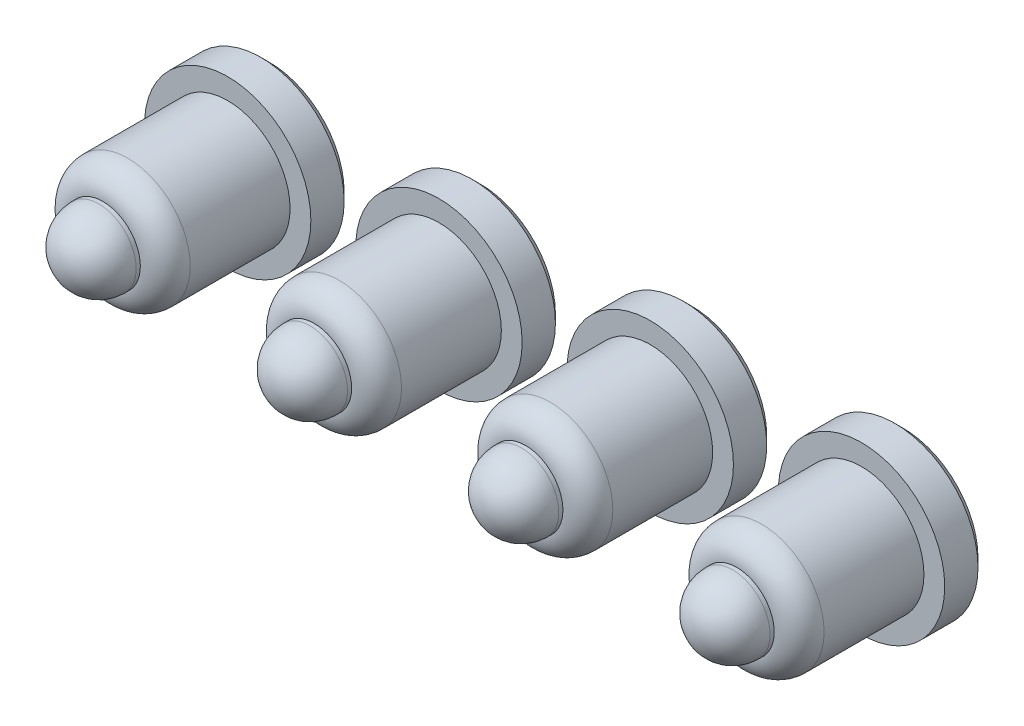
ISO-10303-21;
HEADER;
FILE_DESCRIPTION(('STEP AP214'),'2;1');
FILE_NAME('part.step','',(''),(''),'','','');
FILE_SCHEMA(('AUTOMOTIVE_DESIGN { 1 0 10303 214 1 1 1 1 }'));
ENDSEC;
DATA;
#1=APPLICATION_CONTEXT('core data for automotive mechanical design processes');
#2=APPLICATION_PROTOCOL_DEFINITION('international standard','automotive_design',2000,#1);
#3=PRODUCT_CONTEXT('',#1,'mechanical');
#4=PRODUCT('Part','Part','',(#3));
#5=PRODUCT_RELATED_PRODUCT_CATEGORY('part','',(#4));
#6=PRODUCT_DEFINITION_FORMATION('','',#4);
#7=PRODUCT_DEFINITION_CONTEXT('part definition',#1,'design');
#8=PRODUCT_DEFINITION('design','',#6,#7);
#9=PRODUCT_DEFINITION_SHAPE('','',#8);
#10=(LENGTH_UNIT() NAMED_UNIT(*) SI_UNIT(.MILLI.,.METRE.));
#11=(NAMED_UNIT(*) PLANE_ANGLE_UNIT() SI_UNIT($,.RADIAN.));
#12=(NAMED_UNIT(*) SI_UNIT($,.STERADIAN.) SOLID_ANGLE_UNIT());
#13=UNCERTAINTY_MEASURE_WITH_UNIT(LENGTH_MEASURE(1.E-05),#10,'distance_accuracy_value','');
#14=(GEOMETRIC_REPRESENTATION_CONTEXT(3) GLOBAL_UNCERTAINTY_ASSIGNED_CONTEXT((#13)) GLOBAL_UNIT_ASSIGNED_CONTEXT((#10,
#11,#12)) REPRESENTATION_CONTEXT('',''));
#15=CARTESIAN_POINT('',(0.,0.,0.));
#16=DIRECTION('',(0.,0.,1.));
#17=DIRECTION('',(1.,0.,0.));
#18=AXIS2_PLACEMENT_3D('',#15,#16,#17);
#19=CARTESIAN_POINT('',(7.62,0.,2.));
#20=DIRECTION('',(0.,0.,-1.));
#21=DIRECTION('',(-1.,0.,0.));
#22=AXIS2_PLACEMENT_3D('',#19,#20,#21);
#23=CYLINDRICAL_SURFACE('',#22,0.45);
#24=CARTESIAN_POINT('',(7.62,0.,1.55));
#25=DIRECTION('',(0.,0.,-1.));
#26=DIRECTION('',(-1.,0.,0.));
#27=AXIS2_PLACEMENT_3D('',#24,#25,#26);
#28=CIRCLE('',#27,0.45);
#29=CARTESIAN_POINT('',(7.17,0.,1.55));
#30=VERTEX_POINT('',#29);
#31=EDGE_CURVE('E11',#30,#30,#28,.T.);
#32=ORIENTED_EDGE('',*,*,#31,.T.);
#33=EDGE_LOOP('',(#32));
#34=FACE_BOUND('',#33,.T.);
#35=CARTESIAN_POINT('',(7.62,0.,1.5));
#36=DIRECTION('',(0.,0.,1.));
#37=DIRECTION('',(1.,0.,0.));
#38=AXIS2_PLACEMENT_3D('',#35,#36,#37);
#39=CIRCLE('',#38,0.45);
#40=CARTESIAN_POINT('',(8.07,0.,1.5));
#41=VERTEX_POINT('',#40);
#42=EDGE_CURVE('E51',#41,#41,#39,.T.);
#43=ORIENTED_EDGE('',*,*,#42,.T.);
#44=EDGE_LOOP('',(#43));
#45=FACE_BOUND('',#44,.T.);
#46=ADVANCED_FACE('F44',(#34,#45),#23,.T.);
#47=CARTESIAN_POINT('',(7.62,0.,1.5));
#48=DIRECTION('',(0.,0.,1.));
#49=DIRECTION('',(1.,0.,0.));
#50=AXIS2_PLACEMENT_3D('',#47,#48,#49);
#51=PLANE('',#50);
#52=ORIENTED_EDGE('',*,*,#42,.F.);
#53=EDGE_LOOP('',(#52));
#54=FACE_BOUND('',#53,.T.);
#55=ADVANCED_FACE('F58',(#54),#51,.F.);
#56=CARTESIAN_POINT('',(7.62,0.,1.55));
#57=DIRECTION('',(0.,0.,1.));
#58=DIRECTION('',(1.,0.,0.));
#59=AXIS2_PLACEMENT_3D('',#56,#57,#58);
#60=SPHERICAL_SURFACE('',#59,0.45);
#61=ORIENTED_EDGE('',*,*,#31,.F.);
#62=EDGE_LOOP('',(#61));
#63=FACE_BOUND('',#62,.T.);
#64=ADVANCED_FACE('F46',(#63),#60,.T.);
#65=CLOSED_SHELL('',(#46,#55,#64));
#66=MANIFOLD_SOLID_BREP('B2',#65);
#67=CARTESIAN_POINT('',(5.08,0.,2.));
#68=DIRECTION('',(0.,0.,-1.));
#69=DIRECTION('',(-1.,0.,0.));
#70=AXIS2_PLACEMENT_3D('',#67,#68,#69);
#71=CYLINDRICAL_SURFACE('',#70,0.45);
#72=CARTESIAN_POINT('',(5.08,0.,1.55));
#73=DIRECTION('',(0.,0.,-1.));
#74=DIRECTION('',(-1.,0.,0.));
#75=AXIS2_PLACEMENT_3D('',#72,#73,#74);
#76=CIRCLE('',#75,0.45);
#77=CARTESIAN_POINT('',(4.63,0.,1.55));
#78=VERTEX_POINT('',#77);
#79=EDGE_CURVE('E43',#78,#78,#76,.T.);
#80=ORIENTED_EDGE('',*,*,#79,.T.);
#81=EDGE_LOOP('',(#80));
#82=FACE_BOUND('',#81,.T.);
#83=CARTESIAN_POINT('',(5.08,0.,1.5));
#84=DIRECTION('',(0.,0.,1.));
#85=DIRECTION('',(1.,0.,0.));
#86=AXIS2_PLACEMENT_3D('',#83,#84,#85);
#87=CIRCLE('',#86,0.45);
#88=CARTESIAN_POINT('',(5.53,0.,1.5));
#89=VERTEX_POINT('',#88);
#90=EDGE_CURVE('E100',#89,#89,#87,.T.);
#91=ORIENTED_EDGE('',*,*,#90,.T.);
#92=EDGE_LOOP('',(#91));
#93=FACE_BOUND('',#92,.T.);
#94=ADVANCED_FACE('F93',(#82,#93),#71,.T.);
#95=CARTESIAN_POINT('',(5.08,0.,1.5));
#96=DIRECTION('',(0.,0.,1.));
#97=DIRECTION('',(1.,0.,0.));
#98=AXIS2_PLACEMENT_3D('',#95,#96,#97);
#99=PLANE('',#98);
#100=ORIENTED_EDGE('',*,*,#90,.F.);
#101=EDGE_LOOP('',(#100));
#102=FACE_BOUND('',#101,.T.);
#103=ADVANCED_FACE('F107',(#102),#99,.F.);
#104=CARTESIAN_POINT('',(5.08,0.,1.55));
#105=DIRECTION('',(0.,0.,1.));
#106=DIRECTION('',(1.,0.,0.));
#107=AXIS2_PLACEMENT_3D('',#104,#105,#106);
#108=SPHERICAL_SURFACE('',#107,0.45);
#109=ORIENTED_EDGE('',*,*,#79,.F.);
#110=EDGE_LOOP('',(#109));
#111=FACE_BOUND('',#110,.T.);
#112=ADVANCED_FACE('F95',(#111),#108,.T.);
#113=CLOSED_SHELL('',(#94,#103,#112));
#114=MANIFOLD_SOLID_BREP('B6',#113);
#115=CARTESIAN_POINT('',(2.54,0.,2.));
#116=DIRECTION('',(0.,0.,-1.));
#117=DIRECTION('',(-1.,0.,0.));
#118=AXIS2_PLACEMENT_3D('',#115,#116,#117);
#119=CYLINDRICAL_SURFACE('',#118,0.45);
#120=CARTESIAN_POINT('',(2.54,0.,1.55));
#121=DIRECTION('',(0.,0.,-1.));
#122=DIRECTION('',(-1.,0.,0.));
#123=AXIS2_PLACEMENT_3D('',#120,#121,#122);
#124=CIRCLE('',#123,0.45);
#125=CARTESIAN_POINT('',(2.09,0.,1.55));
#126=VERTEX_POINT('',#125);
#127=EDGE_CURVE('E92',#126,#126,#124,.T.);
#128=ORIENTED_EDGE('',*,*,#127,.T.);
#129=EDGE_LOOP('',(#128));
#130=FACE_BOUND('',#129,.T.);
#131=CARTESIAN_POINT('',(2.54,0.,1.5));
#132=DIRECTION('',(0.,0.,1.));
#133=DIRECTION('',(1.,0.,0.));
#134=AXIS2_PLACEMENT_3D('',#131,#132,#133);
#135=CIRCLE('',#134,0.45);
#136=CARTESIAN_POINT('',(2.99,0.,1.5));
#137=VERTEX_POINT('',#136);
#138=EDGE_CURVE('E149',#137,#137,#135,.T.);
#139=ORIENTED_EDGE('',*,*,#138,.T.);
#140=EDGE_LOOP('',(#139));
#141=FACE_BOUND('',#140,.T.);
#142=ADVANCED_FACE('F142',(#130,#141),#119,.T.);
#143=CARTESIAN_POINT('',(2.54,0.,1.5));
#144=DIRECTION('',(0.,0.,1.));
#145=DIRECTION('',(1.,0.,0.));
#146=AXIS2_PLACEMENT_3D('',#143,#144,#145);
#147=PLANE('',#146);
#148=ORIENTED_EDGE('',*,*,#138,.F.);
#149=EDGE_LOOP('',(#148));
#150=FACE_BOUND('',#149,.T.);
#151=ADVANCED_FACE('F156',(#150),#147,.F.);
#152=CARTESIAN_POINT('',(2.54,0.,1.55));
#153=DIRECTION('',(0.,0.,1.));
#154=DIRECTION('',(1.,0.,0.));
#155=AXIS2_PLACEMENT_3D('',#152,#153,#154);
#156=SPHERICAL_SURFACE('',#155,0.45);
#157=ORIENTED_EDGE('',*,*,#127,.F.);
#158=EDGE_LOOP('',(#157));
#159=FACE_BOUND('',#158,.T.);
#160=ADVANCED_FACE('F144',(#159),#156,.T.);
#161=CLOSED_SHELL('',(#142,#151,#160));
#162=MANIFOLD_SOLID_BREP('B38',#161);
#163=CARTESIAN_POINT('',(7.62,0.,-0.5));
#164=DIRECTION('',(0.,0.,1.));
#165=DIRECTION('',(1.,0.,0.));
#166=AXIS2_PLACEMENT_3D('',#163,#164,#165);
#167=CYLINDRICAL_SURFACE('',#166,1.);
#168=CARTESIAN_POINT('',(7.62,0.,-0.399999999999999));
#169=DIRECTION('',(0.,0.,1.));
#170=DIRECTION('',(1.,0.,0.));
#171=AXIS2_PLACEMENT_3D('',#168,#169,#170);
#172=CIRCLE('',#171,1.);
#173=CARTESIAN_POINT('',(8.62,0.,-0.399999999999999));
#174=VERTEX_POINT('',#173);
#175=EDGE_CURVE('E198',#174,#174,#172,.T.);
#176=ORIENTED_EDGE('',*,*,#175,.T.);
#177=EDGE_LOOP('',(#176));
#178=FACE_BOUND('',#177,.T.);
#179=CARTESIAN_POINT('',(7.62,0.,0.));
#180=DIRECTION('',(0.,0.,1.));
#181=DIRECTION('',(1.,0.,0.));
#182=AXIS2_PLACEMENT_3D('',#179,#180,#181);
#183=CIRCLE('',#182,1.);
#184=CARTESIAN_POINT('',(8.62,0.,0.));
#185=VERTEX_POINT('',#184);
#186=EDGE_CURVE('E202',#185,#185,#183,.T.);
#187=ORIENTED_EDGE('',*,*,#186,.F.);
#188=EDGE_LOOP('',(#187));
#189=FACE_BOUND('',#188,.T.);
#190=ADVANCED_FACE('F191',(#178,#189),#167,.T.);
#191=CARTESIAN_POINT('',(7.62,0.,-0.5));
#192=DIRECTION('',(0.,0.,1.));
#193=DIRECTION('',(1.,0.,0.));
#194=AXIS2_PLACEMENT_3D('',#191,#192,#193);
#195=PLANE('',#194);
#196=CARTESIAN_POINT('',(7.62,0.,-0.5));
#197=DIRECTION('',(0.,0.,1.));
#198=DIRECTION('',(1.,0.,0.));
#199=AXIS2_PLACEMENT_3D('',#196,#197,#198);
#200=CIRCLE('',#199,0.9);
#201=CARTESIAN_POINT('',(8.52,0.,-0.5));
#202=VERTEX_POINT('',#201);
#203=EDGE_CURVE('E141',#202,#202,#200,.F.);
#204=ORIENTED_EDGE('',*,*,#203,.T.);
#205=EDGE_LOOP('',(#204));
#206=FACE_BOUND('',#205,.T.);
#207=ADVANCED_FACE('F212',(#206),#195,.F.);
#208=CARTESIAN_POINT('',(7.62,0.,0.));
#209=DIRECTION('',(0.,0.,1.));
#210=DIRECTION('',(1.,0.,0.));
#211=AXIS2_PLACEMENT_3D('',#208,#209,#210);
#212=PLANE('',#211);
#213=ORIENTED_EDGE('',*,*,#186,.T.);
#214=EDGE_LOOP('',(#213));
#215=FACE_BOUND('',#214,.T.);
#216=ADVANCED_FACE('F209',(#215),#212,.T.);
#217=CARTESIAN_POINT('',(7.62,0.,-0.399999999999999));
#218=DIRECTION('',(0.,0.,1.));
#219=DIRECTION('',(1.,0.,0.));
#220=AXIS2_PLACEMENT_3D('',#217,#218,#219);
#221=CONICAL_SURFACE('',#220,1.,0.785398163397444);
#222=ORIENTED_EDGE('',*,*,#203,.F.);
#223=EDGE_LOOP('',(#222));
#224=FACE_BOUND('',#223,.T.);
#225=ORIENTED_EDGE('',*,*,#175,.F.);
#226=EDGE_LOOP('',(#225));
#227=FACE_BOUND('',#226,.T.);
#228=ADVANCED_FACE('F193',(#224,#227),#221,.T.);
#229=CLOSED_SHELL('',(#190,#207,#216,#228));
#230=MANIFOLD_SOLID_BREP('B87',#229);
#231=CARTESIAN_POINT('',(5.08,0.,-0.5));
#232=DIRECTION('',(0.,0.,1.));
#233=DIRECTION('',(1.,0.,0.));
#234=AXIS2_PLACEMENT_3D('',#231,#232,#233);
#235=CYLINDRICAL_SURFACE('',#234,1.);
#236=CARTESIAN_POINT('',(5.08,0.,-0.4));
#237=DIRECTION('',(0.,0.,1.));
#238=DIRECTION('',(1.,0.,0.));
#239=AXIS2_PLACEMENT_3D('',#236,#237,#238);
#240=CIRCLE('',#239,1.);
#241=CARTESIAN_POINT('',(6.08,0.,-0.4));
#242=VERTEX_POINT('',#241);
#243=EDGE_CURVE('E262',#242,#242,#240,.T.);
#244=ORIENTED_EDGE('',*,*,#243,.T.);
#245=EDGE_LOOP('',(#244));
#246=FACE_BOUND('',#245,.T.);
#247=CARTESIAN_POINT('',(5.08,0.,0.));
#248=DIRECTION('',(0.,0.,1.));
#249=DIRECTION('',(1.,0.,0.));
#250=AXIS2_PLACEMENT_3D('',#247,#248,#249);
#251=CIRCLE('',#250,1.);
#252=CARTESIAN_POINT('',(6.08,0.,0.));
#253=VERTEX_POINT('',#252);
#254=EDGE_CURVE('E266',#253,#253,#251,.T.);
#255=ORIENTED_EDGE('',*,*,#254,.F.);
#256=EDGE_LOOP('',(#255));
#257=FACE_BOUND('',#256,.T.);
#258=ADVANCED_FACE('F255',(#246,#257),#235,.T.);
#259=CARTESIAN_POINT('',(5.08,0.,-0.5));
#260=DIRECTION('',(0.,0.,1.));
#261=DIRECTION('',(1.,0.,0.));
#262=AXIS2_PLACEMENT_3D('',#259,#260,#261);
#263=PLANE('',#262);
#264=CARTESIAN_POINT('',(5.08,0.,-0.5));
#265=DIRECTION('',(0.,0.,1.));
#266=DIRECTION('',(1.,0.,0.));
#267=AXIS2_PLACEMENT_3D('',#264,#265,#266);
#268=CIRCLE('',#267,0.9);
#269=CARTESIAN_POINT('',(5.98,0.,-0.5));
#270=VERTEX_POINT('',#269);
#271=EDGE_CURVE('E190',#270,#270,#268,.F.);
#272=ORIENTED_EDGE('',*,*,#271,.T.);
#273=EDGE_LOOP('',(#272));
#274=FACE_BOUND('',#273,.T.);
#275=ADVANCED_FACE('F276',(#274),#263,.F.);
#276=CARTESIAN_POINT('',(5.08,0.,0.));
#277=DIRECTION('',(0.,0.,1.));
#278=DIRECTION('',(1.,0.,0.));
#279=AXIS2_PLACEMENT_3D('',#276,#277,#278);
#280=PLANE('',#279);
#281=ORIENTED_EDGE('',*,*,#254,.T.);
#282=EDGE_LOOP('',(#281));
#283=FACE_BOUND('',#282,.T.);
#284=ADVANCED_FACE('F273',(#283),#280,.T.);
#285=CARTESIAN_POINT('',(5.08,0.,-0.4));
#286=DIRECTION('',(0.,0.,1.));
#287=DIRECTION('',(1.,0.,0.));
#288=AXIS2_PLACEMENT_3D('',#285,#286,#287);
#289=CONICAL_SURFACE('',#288,1.,0.785398163397447);
#290=ORIENTED_EDGE('',*,*,#271,.F.);
#291=EDGE_LOOP('',(#290));
#292=FACE_BOUND('',#291,.T.);
#293=ORIENTED_EDGE('',*,*,#243,.F.);
#294=EDGE_LOOP('',(#293));
#295=FACE_BOUND('',#294,.T.);
#296=ADVANCED_FACE('F257',(#292,#295),#289,.T.);
#297=CLOSED_SHELL('',(#258,#275,#284,#296));
#298=MANIFOLD_SOLID_BREP('B136',#297);
#299=CARTESIAN_POINT('',(2.54,0.,-0.5));
#300=DIRECTION('',(0.,0.,1.));
#301=DIRECTION('',(1.,0.,0.));
#302=AXIS2_PLACEMENT_3D('',#299,#300,#301);
#303=CYLINDRICAL_SURFACE('',#302,1.);
#304=CARTESIAN_POINT('',(2.54,0.,-0.4));
#305=DIRECTION('',(0.,0.,1.));
#306=DIRECTION('',(1.,0.,0.));
#307=AXIS2_PLACEMENT_3D('',#304,#305,#306);
#308=CIRCLE('',#307,1.);
#309=CARTESIAN_POINT('',(3.54,0.,-0.4));
#310=VERTEX_POINT('',#309);
#311=EDGE_CURVE('E326',#310,#310,#308,.T.);
#312=ORIENTED_EDGE('',*,*,#311,.T.);
#313=EDGE_LOOP('',(#312));
#314=FACE_BOUND('',#313,.T.);
#315=CARTESIAN_POINT('',(2.54,0.,0.));
#316=DIRECTION('',(0.,0.,1.));
#317=DIRECTION('',(1.,0.,0.));
#318=AXIS2_PLACEMENT_3D('',#315,#316,#317);
#319=CIRCLE('',#318,1.);
#320=CARTESIAN_POINT('',(3.54,0.,0.));
#321=VERTEX_POINT('',#320);
#322=EDGE_CURVE('E330',#321,#321,#319,.T.);
#323=ORIENTED_EDGE('',*,*,#322,.F.);
#324=EDGE_LOOP('',(#323));
#325=FACE_BOUND('',#324,.T.);
#326=ADVANCED_FACE('F319',(#314,#325),#303,.T.);
#327=CARTESIAN_POINT('',(2.54,0.,-0.5));
#328=DIRECTION('',(0.,0.,1.));
#329=DIRECTION('',(1.,0.,0.));
#330=AXIS2_PLACEMENT_3D('',#327,#328,#329);
#331=PLANE('',#330);
#332=CARTESIAN_POINT('',(2.54,0.,-0.5));
#333=DIRECTION('',(0.,0.,1.));
#334=DIRECTION('',(1.,0.,0.));
#335=AXIS2_PLACEMENT_3D('',#332,#333,#334);
#336=CIRCLE('',#335,0.9);
#337=CARTESIAN_POINT('',(3.44,0.,-0.5));
#338=VERTEX_POINT('',#337);
#339=EDGE_CURVE('E254',#338,#338,#336,.F.);
#340=ORIENTED_EDGE('',*,*,#339,.T.);
#341=EDGE_LOOP('',(#340));
#342=FACE_BOUND('',#341,.T.);
#343=ADVANCED_FACE('F340',(#342),#331,.F.);
#344=CARTESIAN_POINT('',(2.54,0.,0.));
#345=DIRECTION('',(0.,0.,1.));
#346=DIRECTION('',(1.,0.,0.));
#347=AXIS2_PLACEMENT_3D('',#344,#345,#346);
#348=PLANE('',#347);
#349=ORIENTED_EDGE('',*,*,#322,.T.);
#350=EDGE_LOOP('',(#349));
#351=FACE_BOUND('',#350,.T.);
#352=ADVANCED_FACE('F337',(#351),#348,.T.);
#353=CARTESIAN_POINT('',(2.54,0.,-0.4));
#354=DIRECTION('',(0.,0.,1.));
#355=DIRECTION('',(1.,0.,0.));
#356=AXIS2_PLACEMENT_3D('',#353,#354,#355);
#357=CONICAL_SURFACE('',#356,1.,0.785398163397449);
#358=ORIENTED_EDGE('',*,*,#339,.F.);
#359=EDGE_LOOP('',(#358));
#360=FACE_BOUND('',#359,.T.);
#361=ORIENTED_EDGE('',*,*,#311,.F.);
#362=EDGE_LOOP('',(#361));
#363=FACE_BOUND('',#362,.T.);
#364=ADVANCED_FACE('F321',(#360,#363),#357,.T.);
#365=CLOSED_SHELL('',(#326,#343,#352,#364));
#366=MANIFOLD_SOLID_BREP('B185',#365);
#367=CARTESIAN_POINT('',(7.62,0.,1.5));
#368=DIRECTION('',(0.,0.,-1.));
#369=DIRECTION('',(-1.,0.,0.));
#370=AXIS2_PLACEMENT_3D('',#367,#368,#369);
#371=CYLINDRICAL_SURFACE('',#370,0.75);
#372=CARTESIAN_POINT('',(7.62,0.,1.2));
#373=DIRECTION('',(0.,0.,1.));
#374=DIRECTION('',(1.,0.,0.));
#375=AXIS2_PLACEMENT_3D('',#372,#373,#374);
#376=CIRCLE('',#375,0.75);
#377=CARTESIAN_POINT('',(8.37,0.,1.2));
#378=VERTEX_POINT('',#377);
#379=EDGE_CURVE('E318',#378,#378,#376,.F.);
#380=ORIENTED_EDGE('',*,*,#379,.T.);
#381=EDGE_LOOP('',(#380));
#382=FACE_BOUND('',#381,.T.);
#383=CARTESIAN_POINT('',(7.62,0.,0.));
#384=DIRECTION('',(0.,0.,1.));
#385=DIRECTION('',(1.,0.,0.));
#386=AXIS2_PLACEMENT_3D('',#383,#384,#385);
#387=CIRCLE('',#386,0.75);
#388=CARTESIAN_POINT('',(8.37,0.,0.));
#389=VERTEX_POINT('',#388);
#390=EDGE_CURVE('E394',#389,#389,#387,.T.);
#391=ORIENTED_EDGE('',*,*,#390,.T.);
#392=EDGE_LOOP('',(#391));
#393=FACE_BOUND('',#392,.T.);
#394=ADVANCED_FACE('F383',(#382,#393),#371,.T.);
#395=CARTESIAN_POINT('',(7.62,0.,1.5));
#396=DIRECTION('',(0.,0.,1.));
#397=DIRECTION('',(1.,0.,0.));
#398=AXIS2_PLACEMENT_3D('',#395,#396,#397);
#399=PLANE('',#398);
#400=CARTESIAN_POINT('',(7.62,0.,1.5));
#401=DIRECTION('',(0.,0.,1.));
#402=DIRECTION('',(1.,0.,0.));
#403=AXIS2_PLACEMENT_3D('',#400,#401,#402);
#404=CIRCLE('',#403,0.45);
#405=CARTESIAN_POINT('',(8.07,0.,1.5));
#406=VERTEX_POINT('',#405);
#407=EDGE_CURVE('E390',#406,#406,#404,.T.);
#408=ORIENTED_EDGE('',*,*,#407,.T.);
#409=EDGE_LOOP('',(#408));
#410=FACE_BOUND('',#409,.T.);
#411=ADVANCED_FACE('F404',(#410),#399,.T.);
#412=CARTESIAN_POINT('',(7.62,0.,0.));
#413=DIRECTION('',(0.,0.,1.));
#414=DIRECTION('',(1.,0.,0.));
#415=AXIS2_PLACEMENT_3D('',#412,#413,#414);
#416=PLANE('',#415);
#417=ORIENTED_EDGE('',*,*,#390,.F.);
#418=EDGE_LOOP('',(#417));
#419=FACE_BOUND('',#418,.T.);
#420=ADVANCED_FACE('F402',(#419),#416,.F.);
#421=CARTESIAN_POINT('',(7.62,0.,1.2));
#422=DIRECTION('',(0.,0.,1.));
#423=DIRECTION('',(1.,0.,0.));
#424=AXIS2_PLACEMENT_3D('',#421,#422,#423);
#425=TOROIDAL_SURFACE('',#424,0.45,0.3);
#426=ORIENTED_EDGE('',*,*,#379,.F.);
#427=EDGE_LOOP('',(#426));
#428=FACE_BOUND('',#427,.T.);
#429=ORIENTED_EDGE('',*,*,#407,.F.);
#430=EDGE_LOOP('',(#429));
#431=FACE_BOUND('',#430,.T.);
#432=ADVANCED_FACE('F385',(#428,#431),#425,.T.);
#433=CLOSED_SHELL('',(#394,#411,#420,#432));
#434=MANIFOLD_SOLID_BREP('B249',#433);
#435=CARTESIAN_POINT('',(5.08,0.,1.5));
#436=DIRECTION('',(0.,0.,-1.));
#437=DIRECTION('',(-1.,0.,0.));
#438=AXIS2_PLACEMENT_3D('',#435,#436,#437);
#439=CYLINDRICAL_SURFACE('',#438,0.749999999999999);
#440=CARTESIAN_POINT('',(5.08,0.,1.2));
#441=DIRECTION('',(0.,0.,1.));
#442=DIRECTION('',(1.,0.,0.));
#443=AXIS2_PLACEMENT_3D('',#440,#441,#442);
#444=CIRCLE('',#443,0.749999999999999);
#445=CARTESIAN_POINT('',(5.83,0.,1.2));
#446=VERTEX_POINT('',#445);
#447=EDGE_CURVE('E382',#446,#446,#444,.F.);
#448=ORIENTED_EDGE('',*,*,#447,.T.);
#449=EDGE_LOOP('',(#448));
#450=FACE_BOUND('',#449,.T.);
#451=CARTESIAN_POINT('',(5.08,0.,0.));
#452=DIRECTION('',(0.,0.,1.));
#453=DIRECTION('',(1.,0.,0.));
#454=AXIS2_PLACEMENT_3D('',#451,#452,#453);
#455=CIRCLE('',#454,0.749999999999999);
#456=CARTESIAN_POINT('',(5.83,0.,0.));
#457=VERTEX_POINT('',#456);
#458=EDGE_CURVE('E458',#457,#457,#455,.T.);
#459=ORIENTED_EDGE('',*,*,#458,.T.);
#460=EDGE_LOOP('',(#459));
#461=FACE_BOUND('',#460,.T.);
#462=ADVANCED_FACE('F447',(#450,#461),#439,.T.);
#463=CARTESIAN_POINT('',(5.08,0.,1.5));
#464=DIRECTION('',(0.,0.,1.));
#465=DIRECTION('',(1.,0.,0.));
#466=AXIS2_PLACEMENT_3D('',#463,#464,#465);
#467=PLANE('',#466);
#468=CARTESIAN_POINT('',(5.08,0.,1.5));
#469=DIRECTION('',(0.,0.,1.));
#470=DIRECTION('',(1.,0.,0.));
#471=AXIS2_PLACEMENT_3D('',#468,#469,#470);
#472=CIRCLE('',#471,0.449999999999999);
#473=CARTESIAN_POINT('',(5.53,0.,1.5));
#474=VERTEX_POINT('',#473);
#475=EDGE_CURVE('E454',#474,#474,#472,.T.);
#476=ORIENTED_EDGE('',*,*,#475,.T.);
#477=EDGE_LOOP('',(#476));
#478=FACE_BOUND('',#477,.T.);
#479=ADVANCED_FACE('F468',(#478),#467,.T.);
#480=CARTESIAN_POINT('',(5.08,0.,0.));
#481=DIRECTION('',(0.,0.,1.));
#482=DIRECTION('',(1.,0.,0.));
#483=AXIS2_PLACEMENT_3D('',#480,#481,#482);
#484=PLANE('',#483);
#485=ORIENTED_EDGE('',*,*,#458,.F.);
#486=EDGE_LOOP('',(#485));
#487=FACE_BOUND('',#486,.T.);
#488=ADVANCED_FACE('F466',(#487),#484,.F.);
#489=CARTESIAN_POINT('',(5.08,0.,1.2));
#490=DIRECTION('',(0.,0.,1.));
#491=DIRECTION('',(1.,0.,0.));
#492=AXIS2_PLACEMENT_3D('',#489,#490,#491);
#493=TOROIDAL_SURFACE('',#492,0.449999999999999,0.3);
#494=ORIENTED_EDGE('',*,*,#447,.F.);
#495=EDGE_LOOP('',(#494));
#496=FACE_BOUND('',#495,.T.);
#497=ORIENTED_EDGE('',*,*,#475,.F.);
#498=EDGE_LOOP('',(#497));
#499=FACE_BOUND('',#498,.T.);
#500=ADVANCED_FACE('F449',(#496,#499),#493,.T.);
#501=CLOSED_SHELL('',(#462,#479,#488,#500));
#502=MANIFOLD_SOLID_BREP('B313',#501);
#503=CARTESIAN_POINT('',(2.54,0.,1.5));
#504=DIRECTION('',(0.,0.,-1.));
#505=DIRECTION('',(-1.,0.,0.));
#506=AXIS2_PLACEMENT_3D('',#503,#504,#505);
#507=CYLINDRICAL_SURFACE('',#506,0.75);
#508=CARTESIAN_POINT('',(2.54,0.,1.2));
#509=DIRECTION('',(0.,0.,1.));
#510=DIRECTION('',(1.,0.,0.));
#511=AXIS2_PLACEMENT_3D('',#508,#509,#510);
#512=CIRCLE('',#511,0.75);
#513=CARTESIAN_POINT('',(3.29,0.,1.2));
#514=VERTEX_POINT('',#513);
#515=EDGE_CURVE('E446',#514,#514,#512,.F.);
#516=ORIENTED_EDGE('',*,*,#515,.T.);
#517=EDGE_LOOP('',(#516));
#518=FACE_BOUND('',#517,.T.);
#519=CARTESIAN_POINT('',(2.54,0.,0.));
#520=DIRECTION('',(0.,0.,1.));
#521=DIRECTION('',(1.,0.,0.));
#522=AXIS2_PLACEMENT_3D('',#519,#520,#521);
#523=CIRCLE('',#522,0.75);
#524=CARTESIAN_POINT('',(3.29,0.,0.));
#525=VERTEX_POINT('',#524);
#526=EDGE_CURVE('E521',#525,#525,#523,.T.);
#527=ORIENTED_EDGE('',*,*,#526,.T.);
#528=EDGE_LOOP('',(#527));
#529=FACE_BOUND('',#528,.T.);
#530=ADVANCED_FACE('F510',(#518,#529),#507,.T.);
#531=CARTESIAN_POINT('',(2.54,0.,1.5));
#532=DIRECTION('',(0.,0.,1.));
#533=DIRECTION('',(1.,0.,0.));
#534=AXIS2_PLACEMENT_3D('',#531,#532,#533);
#535=PLANE('',#534);
#536=CARTESIAN_POINT('',(2.54,0.,1.5));
#537=DIRECTION('',(0.,0.,1.));
#538=DIRECTION('',(1.,0.,0.));
#539=AXIS2_PLACEMENT_3D('',#536,#537,#538);
#540=CIRCLE('',#539,0.45);
#541=CARTESIAN_POINT('',(2.99,0.,1.5));
#542=VERTEX_POINT('',#541);
#543=EDGE_CURVE('E517',#542,#542,#540,.T.);
#544=ORIENTED_EDGE('',*,*,#543,.T.);
#545=EDGE_LOOP('',(#544));
#546=FACE_BOUND('',#545,.T.);
#547=ADVANCED_FACE('F531',(#546),#535,.T.);
#548=CARTESIAN_POINT('',(2.54,0.,0.));
#549=DIRECTION('',(0.,0.,1.));
#550=DIRECTION('',(1.,0.,0.));
#551=AXIS2_PLACEMENT_3D('',#548,#549,#550);
#552=PLANE('',#551);
#553=ORIENTED_EDGE('',*,*,#526,.F.);
#554=EDGE_LOOP('',(#553));
#555=FACE_BOUND('',#554,.T.);
#556=ADVANCED_FACE('F529',(#555),#552,.F.);
#557=CARTESIAN_POINT('',(2.54,0.,1.2));
#558=DIRECTION('',(0.,0.,1.));
#559=DIRECTION('',(1.,0.,0.));
#560=AXIS2_PLACEMENT_3D('',#557,#558,#559);
#561=TOROIDAL_SURFACE('',#560,0.45,0.3);
#562=ORIENTED_EDGE('',*,*,#515,.F.);
#563=EDGE_LOOP('',(#562));
#564=FACE_BOUND('',#563,.T.);
#565=ORIENTED_EDGE('',*,*,#543,.F.);
#566=EDGE_LOOP('',(#565));
#567=FACE_BOUND('',#566,.T.);
#568=ADVANCED_FACE('F512',(#564,#567),#561,.T.);
#569=CLOSED_SHELL('',(#530,#547,#556,#568));
#570=MANIFOLD_SOLID_BREP('B377',#569);
#571=CARTESIAN_POINT('',(0.,0.,1.5));
#572=DIRECTION('',(0.,0.,-1.));
#573=DIRECTION('',(-1.,0.,0.));
#574=AXIS2_PLACEMENT_3D('',#571,#572,#573);
#575=CYLINDRICAL_SURFACE('',#574,0.75);
#576=CARTESIAN_POINT('',(0.,0.,1.2));
#577=DIRECTION('',(0.,0.,1.));
#578=DIRECTION('',(1.,0.,0.));
#579=AXIS2_PLACEMENT_3D('',#576,#577,#578);
#580=CIRCLE('',#579,0.75);
#581=CARTESIAN_POINT('',(0.75,0.,1.2));
#582=VERTEX_POINT('',#581);
#583=EDGE_CURVE('E581',#582,#582,#580,.F.);
#584=ORIENTED_EDGE('',*,*,#583,.T.);
#585=EDGE_LOOP('',(#584));
#586=FACE_BOUND('',#585,.T.);
#587=CARTESIAN_POINT('',(0.,0.,0.));
#588=DIRECTION('',(0.,0.,1.));
#589=DIRECTION('',(1.,0.,0.));
#590=AXIS2_PLACEMENT_3D('',#587,#588,#589);
#591=CIRCLE('',#590,0.75);
#592=CARTESIAN_POINT('',(0.75,0.,0.));
#593=VERTEX_POINT('',#592);
#594=EDGE_CURVE('E587',#593,#593,#591,.T.);
#595=ORIENTED_EDGE('',*,*,#594,.T.);
#596=EDGE_LOOP('',(#595));
#597=FACE_BOUND('',#596,.T.);
#598=ADVANCED_FACE('F566',(#586,#597),#575,.T.);
#599=CARTESIAN_POINT('',(0.,0.,-0.5));
#600=DIRECTION('',(0.,0.,1.));
#601=DIRECTION('',(1.,0.,0.));
#602=AXIS2_PLACEMENT_3D('',#599,#600,#601);
#603=CYLINDRICAL_SURFACE('',#602,1.);
#604=CARTESIAN_POINT('',(0.,0.,-0.4));
#605=DIRECTION('',(0.,0.,1.));
#606=DIRECTION('',(1.,0.,0.));
#607=AXIS2_PLACEMENT_3D('',#604,#605,#606);
#608=CIRCLE('',#607,1.);
#609=CARTESIAN_POINT('',(1.,0.,-0.4));
#610=VERTEX_POINT('',#609);
#611=EDGE_CURVE('E573',#610,#610,#608,.T.);
#612=ORIENTED_EDGE('',*,*,#611,.T.);
#613=EDGE_LOOP('',(#612));
#614=FACE_BOUND('',#613,.T.);
#615=CARTESIAN_POINT('',(0.,0.,0.));
#616=DIRECTION('',(0.,0.,1.));
#617=DIRECTION('',(1.,0.,0.));
#618=AXIS2_PLACEMENT_3D('',#615,#616,#617);
#619=CIRCLE('',#618,1.);
#620=CARTESIAN_POINT('',(1.,0.,0.));
#621=VERTEX_POINT('',#620);
#622=EDGE_CURVE('E590',#621,#621,#619,.T.);
#623=ORIENTED_EDGE('',*,*,#622,.F.);
#624=EDGE_LOOP('',(#623));
#625=FACE_BOUND('',#624,.T.);
#626=ADVANCED_FACE('F614',(#614,#625),#603,.T.);
#627=CARTESIAN_POINT('',(0.,0.,-0.5));
#628=DIRECTION('',(0.,0.,1.));
#629=DIRECTION('',(1.,0.,0.));
#630=AXIS2_PLACEMENT_3D('',#627,#628,#629);
#631=PLANE('',#630);
#632=CARTESIAN_POINT('',(0.,0.,-0.5));
#633=DIRECTION('',(0.,0.,1.));
#634=DIRECTION('',(1.,0.,0.));
#635=AXIS2_PLACEMENT_3D('',#632,#633,#634);
#636=CIRCLE('',#635,0.9);
#637=CARTESIAN_POINT('',(0.9,0.,-0.5));
#638=VERTEX_POINT('',#637);
#639=EDGE_CURVE('E509',#638,#638,#636,.F.);
#640=ORIENTED_EDGE('',*,*,#639,.T.);
#641=EDGE_LOOP('',(#640));
#642=FACE_BOUND('',#641,.T.);
#643=ADVANCED_FACE('F619',(#642),#631,.F.);
#644=CARTESIAN_POINT('',(0.,0.,0.));
#645=DIRECTION('',(0.,0.,1.));
#646=DIRECTION('',(1.,0.,0.));
#647=AXIS2_PLACEMENT_3D('',#644,#645,#646);
#648=PLANE('',#647);
#649=ORIENTED_EDGE('',*,*,#594,.F.);
#650=EDGE_LOOP('',(#649));
#651=FACE_BOUND('',#650,.T.);
#652=ORIENTED_EDGE('',*,*,#622,.T.);
#653=EDGE_LOOP('',(#652));
#654=FACE_BOUND('',#653,.T.);
#655=ADVANCED_FACE('F608',(#651,#654),#648,.T.);
#656=CARTESIAN_POINT('',(0.,0.,2.));
#657=DIRECTION('',(0.,0.,-1.));
#658=DIRECTION('',(-1.,0.,0.));
#659=AXIS2_PLACEMENT_3D('',#656,#657,#658);
#660=CYLINDRICAL_SURFACE('',#659,0.45);
#661=CARTESIAN_POINT('',(0.,0.,1.55));
#662=DIRECTION('',(0.,0.,-1.));
#663=DIRECTION('',(-1.,0.,0.));
#664=AXIS2_PLACEMENT_3D('',#661,#662,#663);
#665=CIRCLE('',#664,0.45);
#666=CARTESIAN_POINT('',(-0.45,0.,1.55));
#667=VERTEX_POINT('',#666);
#668=EDGE_CURVE('E577',#667,#667,#665,.T.);
#669=ORIENTED_EDGE('',*,*,#668,.T.);
#670=EDGE_LOOP('',(#669));
#671=FACE_BOUND('',#670,.T.);
#672=CARTESIAN_POINT('',(0.,0.,1.5));
#673=DIRECTION('',(0.,0.,1.));
#674=DIRECTION('',(1.,0.,0.));
#675=AXIS2_PLACEMENT_3D('',#672,#673,#674);
#676=CIRCLE('',#675,0.45);
#677=CARTESIAN_POINT('',(0.45,0.,1.5));
#678=VERTEX_POINT('',#677);
#679=EDGE_CURVE('E586',#678,#678,#676,.T.);
#680=ORIENTED_EDGE('',*,*,#679,.T.);
#681=EDGE_LOOP('',(#680));
#682=FACE_BOUND('',#681,.T.);
#683=ADVANCED_FACE('F596',(#671,#682),#660,.T.);
#684=CARTESIAN_POINT('',(0.,0.,1.2));
#685=DIRECTION('',(0.,0.,1.));
#686=DIRECTION('',(1.,0.,0.));
#687=AXIS2_PLACEMENT_3D('',#684,#685,#686);
#688=TOROIDAL_SURFACE('',#687,0.45,0.3);
#689=ORIENTED_EDGE('',*,*,#583,.F.);
#690=EDGE_LOOP('',(#689));
#691=FACE_BOUND('',#690,.T.);
#692=ORIENTED_EDGE('',*,*,#679,.F.);
#693=EDGE_LOOP('',(#692));
#694=FACE_BOUND('',#693,.T.);
#695=ADVANCED_FACE('F598',(#691,#694),#688,.T.);
#696=CARTESIAN_POINT('',(0.,0.,1.55));
#697=DIRECTION('',(0.,0.,1.));
#698=DIRECTION('',(1.,0.,0.));
#699=AXIS2_PLACEMENT_3D('',#696,#697,#698);
#700=SPHERICAL_SURFACE('',#699,0.45);
#701=ORIENTED_EDGE('',*,*,#668,.F.);
#702=EDGE_LOOP('',(#701));
#703=FACE_BOUND('',#702,.T.);
#704=ADVANCED_FACE('F600',(#703),#700,.T.);
#705=CARTESIAN_POINT('',(0.,0.,-0.4));
#706=DIRECTION('',(0.,0.,1.));
#707=DIRECTION('',(1.,0.,0.));
#708=AXIS2_PLACEMENT_3D('',#705,#706,#707);
#709=CONICAL_SURFACE('',#708,1.,0.78539816339745);
#710=CARTESIAN_POINT('',(0.9,0.,-0.5));
#711=CARTESIAN_POINT('',(0.901041666666666,0.,-0.498958333333333));
#712=CARTESIAN_POINT('',(0.902083333333333,0.,-0.497916666666667));
#713=CARTESIAN_POINT('',(0.904166666666666,0.,-0.495833333333333));
#714=CARTESIAN_POINT('',(0.905208333333333,0.,-0.494791666666667));
#715=CARTESIAN_POINT('',(0.907291666666666,0.,-0.492708333333333));
#716=CARTESIAN_POINT('',(0.908333333333333,0.,-0.491666666666667));
#717=CARTESIAN_POINT('',(0.910416666666666,0.,-0.489583333333333));
#718=CARTESIAN_POINT('',(0.911458333333333,0.,-0.488541666666667));
#719=CARTESIAN_POINT('',(0.913541666666666,0.,-0.486458333333333));
#720=CARTESIAN_POINT('',(0.914583333333333,0.,-0.485416666666667));
#721=CARTESIAN_POINT('',(0.916666666666666,0.,-0.483333333333333));
#722=CARTESIAN_POINT('',(0.917708333333333,0.,-0.482291666666667));
#723=CARTESIAN_POINT('',(0.919791666666666,0.,-0.480208333333333));
#724=CARTESIAN_POINT('',(0.920833333333333,0.,-0.479166666666667));
#725=CARTESIAN_POINT('',(0.922916666666666,0.,-0.477083333333333));
#726=CARTESIAN_POINT('',(0.923958333333333,0.,-0.476041666666667));
#727=CARTESIAN_POINT('',(0.926041666666666,0.,-0.473958333333333));
#728=CARTESIAN_POINT('',(0.927083333333333,0.,-0.472916666666667));
#729=CARTESIAN_POINT('',(0.929166666666666,0.,-0.470833333333333));
#730=CARTESIAN_POINT('',(0.930208333333333,0.,-0.469791666666667));
#731=CARTESIAN_POINT('',(0.932291666666666,0.,-0.467708333333333));
#732=CARTESIAN_POINT('',(0.933333333333333,0.,-0.466666666666667));
#733=CARTESIAN_POINT('',(0.935416666666666,0.,-0.464583333333333));
#734=CARTESIAN_POINT('',(0.936458333333333,0.,-0.463541666666667));
#735=CARTESIAN_POINT('',(0.938541666666666,0.,-0.461458333333333));
#736=CARTESIAN_POINT('',(0.939583333333333,0.,-0.460416666666667));
#737=CARTESIAN_POINT('',(0.941666666666667,0.,-0.458333333333333));
#738=CARTESIAN_POINT('',(0.942708333333333,0.,-0.457291666666667));
#739=CARTESIAN_POINT('',(0.944791666666666,0.,-0.455208333333333));
#740=CARTESIAN_POINT('',(0.945833333333333,0.,-0.454166666666667));
#741=CARTESIAN_POINT('',(0.947916666666666,0.,-0.452083333333333));
#742=CARTESIAN_POINT('',(0.948958333333333,0.,-0.451041666666667));
#743=CARTESIAN_POINT('',(0.951041666666667,0.,-0.448958333333334));
#744=CARTESIAN_POINT('',(0.952083333333333,0.,-0.447916666666667));
#745=CARTESIAN_POINT('',(0.954166666666666,0.,-0.445833333333334));
#746=CARTESIAN_POINT('',(0.955208333333333,0.,-0.444791666666667));
#747=CARTESIAN_POINT('',(0.957291666666667,0.,-0.442708333333333));
#748=CARTESIAN_POINT('',(0.958333333333333,0.,-0.441666666666667));
#749=CARTESIAN_POINT('',(0.960416666666666,0.,-0.439583333333333));
#750=CARTESIAN_POINT('',(0.961458333333333,0.,-0.438541666666667));
#751=CARTESIAN_POINT('',(0.963541666666667,0.,-0.436458333333334));
#752=CARTESIAN_POINT('',(0.964583333333333,0.,-0.435416666666667));
#753=CARTESIAN_POINT('',(0.966666666666667,0.,-0.433333333333333));
#754=CARTESIAN_POINT('',(0.967708333333333,0.,-0.432291666666667));
#755=CARTESIAN_POINT('',(0.969791666666666,0.,-0.430208333333333));
#756=CARTESIAN_POINT('',(0.970833333333333,0.,-0.429166666666667));
#757=CARTESIAN_POINT('',(0.972916666666667,0.,-0.427083333333334));
#758=CARTESIAN_POINT('',(0.973958333333333,0.,-0.426041666666667));
#759=CARTESIAN_POINT('',(0.976041666666667,0.,-0.423958333333334));
#760=CARTESIAN_POINT('',(0.977083333333333,0.,-0.422916666666667));
#761=CARTESIAN_POINT('',(0.979166666666667,0.,-0.420833333333333));
#762=CARTESIAN_POINT('',(0.980208333333333,0.,-0.419791666666667));
#763=CARTESIAN_POINT('',(0.982291666666667,0.,-0.417708333333334));
#764=CARTESIAN_POINT('',(0.983333333333333,0.,-0.416666666666667));
#765=CARTESIAN_POINT('',(0.985416666666667,0.,-0.414583333333334));
#766=CARTESIAN_POINT('',(0.986458333333333,0.,-0.413541666666667));
#767=CARTESIAN_POINT('',(0.988541666666667,0.,-0.411458333333333));
#768=CARTESIAN_POINT('',(0.989583333333333,0.,-0.410416666666667));
#769=CARTESIAN_POINT('',(0.991666666666667,0.,-0.408333333333333));
#770=CARTESIAN_POINT('',(0.992708333333333,0.,-0.407291666666667));
#771=CARTESIAN_POINT('',(0.994791666666667,0.,-0.405208333333334));
#772=CARTESIAN_POINT('',(0.995833333333333,0.,-0.404166666666667));
#773=CARTESIAN_POINT('',(0.997916666666667,0.,-0.402083333333334));
#774=CARTESIAN_POINT('',(0.998958333333333,0.,-0.401041666666667));
#775=CARTESIAN_POINT('',(1.,0.,-0.4));
#776=B_SPLINE_CURVE_WITH_KNOTS('',3,(#710,#711,#712,#713,#714,#715,#716,#717,#718,#719,#720,
#721,#722,#723,#724,#725,#726,#727,#728,#729,#730,#731,#732,#733,#734,#735,#736,#737,#738,#739,
#740,#741,#742,#743,#744,#745,#746,#747,#748,#749,#750,#751,#752,#753,#754,#755,#756,#757,#758,
#759,#760,#761,#762,#763,#764,#765,#766,#767,#768,#769,#770,#771,#772,#773,#774,#775),
.UNSPECIFIED.,.F.,.F.,(4,2,2,2,2,2,2,2,2,2,2,2,2,2,2,2,2,2,2,2,2,2,2,2,2,2,2,2,2,2,2,2,4),(0.,
0.00441941738241597,0.00883883476483194,0.0132582521472478,0.0176776695296637,
0.0220970869120797,0.0265165042944956,0.0309359216769115,0.0353553390593275,0.0397747564417434,
0.0441941738241593,0.0486135912065752,0.0530330085889912,0.0574524259714071,0.061871843353823,
0.0662912607362389,0.0707106781186549,0.0751300955010708,0.0795495128834867,0.0839689302659026,
0.0883883476483186,0.0928077650307345,0.0972271824131504,0.101646599795566,0.106066017177982,
0.110485434560398,0.114904851942814,0.11932426932523,0.123743686707646,0.128163104090062,
0.132582521472478,0.137001938854894,0.14142135623731),.UNSPECIFIED.);
#777=EDGE_CURVE('BSEAM568',#638,#610,#776,.T.);
#778=ORIENTED_EDGE('',*,*,#639,.F.);
#779=ORIENTED_EDGE('',*,*,#611,.F.);
#780=ORIENTED_EDGE('',*,*,#777,.T.);
#781=ORIENTED_EDGE('',*,*,#777,.F.);
#782=EDGE_LOOP('',(#778,#780,#779,#781));
#783=FACE_BOUND('',#782,.T.);
#784=ADVANCED_FACE('F568',(#783),#709,.T.);
#785=CLOSED_SHELL('',(#598,#626,#643,#655,#683,#695,#704,#784));
#786=MANIFOLD_SOLID_BREP('B441',#785);
#787=ADVANCED_BREP_SHAPE_REPRESENTATION('',(#18,#66,#114,#162,#230,#298,#366,#434,#502,#570,
#786),#14);
#788=SHAPE_DEFINITION_REPRESENTATION(#9,#787);
ENDSEC;
END-ISO-10303-21;
